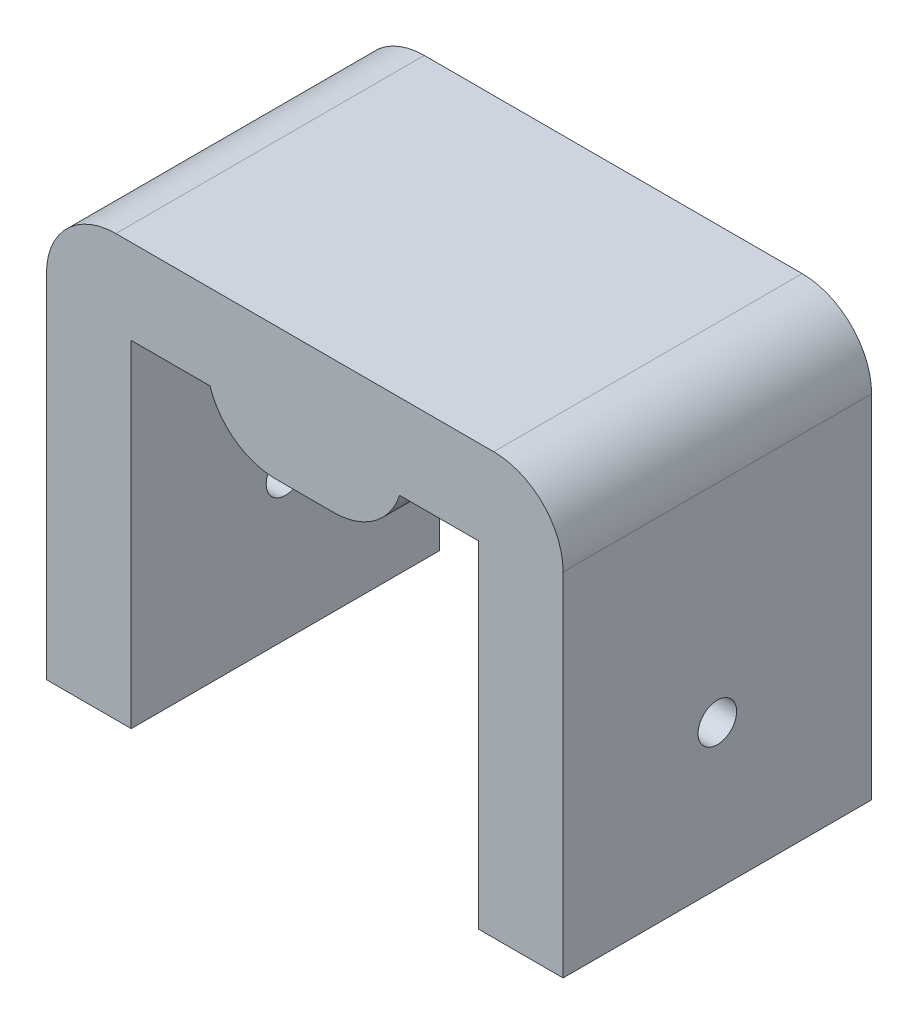
ISO-10303-21;
HEADER;
FILE_DESCRIPTION(('STEP AP214'),'2;1');
FILE_NAME('part.step','',(''),(''),'','','');
FILE_SCHEMA(('AUTOMOTIVE_DESIGN { 1 0 10303 214 1 1 1 1 }'));
ENDSEC;
DATA;
#1=APPLICATION_CONTEXT('core data for automotive mechanical design processes');
#2=APPLICATION_PROTOCOL_DEFINITION('international standard','automotive_design',2000,#1);
#3=PRODUCT_CONTEXT('',#1,'mechanical');
#4=PRODUCT('Part','Part','',(#3));
#5=PRODUCT_RELATED_PRODUCT_CATEGORY('part','',(#4));
#6=PRODUCT_DEFINITION_FORMATION('','',#4);
#7=PRODUCT_DEFINITION_CONTEXT('part definition',#1,'design');
#8=PRODUCT_DEFINITION('design','',#6,#7);
#9=PRODUCT_DEFINITION_SHAPE('','',#8);
#10=(LENGTH_UNIT() NAMED_UNIT(*) SI_UNIT(.MILLI.,.METRE.));
#11=(NAMED_UNIT(*) PLANE_ANGLE_UNIT() SI_UNIT($,.RADIAN.));
#12=(NAMED_UNIT(*) SI_UNIT($,.STERADIAN.) SOLID_ANGLE_UNIT());
#13=UNCERTAINTY_MEASURE_WITH_UNIT(LENGTH_MEASURE(1.E-05),#10,'distance_accuracy_value','');
#14=(GEOMETRIC_REPRESENTATION_CONTEXT(3) GLOBAL_UNCERTAINTY_ASSIGNED_CONTEXT((#13)) GLOBAL_UNIT_ASSIGNED_CONTEXT((#10,
#11,#12)) REPRESENTATION_CONTEXT('',''));
#15=CARTESIAN_POINT('',(0.,0.,0.));
#16=DIRECTION('',(0.,0.,1.));
#17=DIRECTION('',(1.,0.,0.));
#18=AXIS2_PLACEMENT_3D('',#15,#16,#17);
#19=CARTESIAN_POINT('',(-16.75,0.,20.));
#20=DIRECTION('',(-1.,0.,0.));
#21=DIRECTION('',(0.,-1.,0.));
#22=AXIS2_PLACEMENT_3D('',#19,#20,#21);
#23=PLANE('',#22);
#24=CARTESIAN_POINT('',(-16.75,9.35000000000001,10.));
#25=DIRECTION('',(1.,0.,0.));
#26=DIRECTION('',(0.,1.,0.));
#27=AXIS2_PLACEMENT_3D('',#24,#25,#26);
#28=CIRCLE('',#27,1.25);
#29=CARTESIAN_POINT('',(-16.75,10.6,10.));
#30=VERTEX_POINT('',#29);
#31=EDGE_CURVE('E290',#30,#30,#28,.T.);
#32=ORIENTED_EDGE('',*,*,#31,.T.);
#33=EDGE_LOOP('',(#32));
#34=FACE_BOUND('',#33,.T.);
#35=DIRECTION('',(0.,1.,0.));
#36=VECTOR('',#35,1.);
#37=CARTESIAN_POINT('',(-16.75,0.,20.));
#38=LINE('',#37,#36);
#39=CARTESIAN_POINT('',(-16.75,0.,20.));
#40=VERTEX_POINT('',#39);
#41=CARTESIAN_POINT('',(-16.75,22.8,20.));
#42=VERTEX_POINT('',#41);
#43=EDGE_CURVE('E205',#40,#42,#38,.T.);
#44=ORIENTED_EDGE('',*,*,#43,.T.);
#45=DIRECTION('',(0.,0.,-1.));
#46=VECTOR('',#45,1.);
#47=CARTESIAN_POINT('',(-16.75,22.8,20.));
#48=LINE('',#47,#46);
#49=CARTESIAN_POINT('',(-16.75,22.8,0.));
#50=VERTEX_POINT('',#49);
#51=EDGE_CURVE('E235',#42,#50,#48,.T.);
#52=ORIENTED_EDGE('',*,*,#51,.T.);
#53=DIRECTION('',(0.,1.,0.));
#54=VECTOR('',#53,1.);
#55=CARTESIAN_POINT('',(-16.75,0.,0.));
#56=LINE('',#55,#54);
#57=CARTESIAN_POINT('',(-16.75,0.,0.));
#58=VERTEX_POINT('',#57);
#59=EDGE_CURVE('E177',#58,#50,#56,.T.);
#60=ORIENTED_EDGE('',*,*,#59,.F.);
#61=DIRECTION('',(0.,0.,-1.));
#62=VECTOR('',#61,1.);
#63=CARTESIAN_POINT('',(-16.75,0.,20.));
#64=LINE('',#63,#62);
#65=EDGE_CURVE('E206',#40,#58,#64,.T.);
#66=ORIENTED_EDGE('',*,*,#65,.F.);
#67=EDGE_LOOP('',(#44,#52,#60,#66));
#68=FACE_BOUND('',#67,.T.);
#69=ADVANCED_FACE('F33',(#34,#68),#23,.T.);
#70=CARTESIAN_POINT('',(-11.25,0.,20.));
#71=DIRECTION('',(0.,-1.,0.));
#72=DIRECTION('',(1.,0.,0.));
#73=AXIS2_PLACEMENT_3D('',#70,#71,#72);
#74=PLANE('',#73);
#75=DIRECTION('',(-1.,0.,0.));
#76=VECTOR('',#75,1.);
#77=CARTESIAN_POINT('',(-11.25,0.,0.));
#78=LINE('',#77,#76);
#79=CARTESIAN_POINT('',(-11.25,0.,0.));
#80=VERTEX_POINT('',#79);
#81=EDGE_CURVE('E202',#80,#58,#78,.T.);
#82=ORIENTED_EDGE('',*,*,#81,.F.);
#83=DIRECTION('',(0.,0.,-1.));
#84=VECTOR('',#83,1.);
#85=CARTESIAN_POINT('',(-11.25,0.,20.));
#86=LINE('',#85,#84);
#87=CARTESIAN_POINT('',(-11.25,0.,20.));
#88=VERTEX_POINT('',#87);
#89=EDGE_CURVE('E209',#88,#80,#86,.T.);
#90=ORIENTED_EDGE('',*,*,#89,.F.);
#91=DIRECTION('',(-1.,0.,0.));
#92=VECTOR('',#91,1.);
#93=CARTESIAN_POINT('',(-11.25,0.,20.));
#94=LINE('',#93,#92);
#95=EDGE_CURVE('E153',#88,#40,#94,.T.);
#96=ORIENTED_EDGE('',*,*,#95,.T.);
#97=ORIENTED_EDGE('',*,*,#65,.T.);
#98=EDGE_LOOP('',(#82,#90,#96,#97));
#99=FACE_BOUND('',#98,.T.);
#100=ADVANCED_FACE('F266',(#99),#74,.T.);
#101=CARTESIAN_POINT('',(-11.25,21.8,20.));
#102=DIRECTION('',(1.,0.,0.));
#103=DIRECTION('',(0.,1.,0.));
#104=AXIS2_PLACEMENT_3D('',#101,#102,#103);
#105=PLANE('',#104);
#106=CARTESIAN_POINT('',(-11.25,9.35000000000001,10.));
#107=DIRECTION('',(1.,0.,0.));
#108=DIRECTION('',(0.,1.,0.));
#109=AXIS2_PLACEMENT_3D('',#106,#107,#108);
#110=CIRCLE('',#109,1.25);
#111=CARTESIAN_POINT('',(-11.25,10.6,10.));
#112=VERTEX_POINT('',#111);
#113=EDGE_CURVE('E181',#112,#112,#110,.T.);
#114=ORIENTED_EDGE('',*,*,#113,.F.);
#115=EDGE_LOOP('',(#114));
#116=FACE_BOUND('',#115,.T.);
#117=DIRECTION('',(0.,-1.,0.));
#118=VECTOR('',#117,1.);
#119=CARTESIAN_POINT('',(-11.25,21.8,0.));
#120=LINE('',#119,#118);
#121=CARTESIAN_POINT('',(-11.25,21.8,0.));
#122=VERTEX_POINT('',#121);
#123=EDGE_CURVE('E199',#122,#80,#120,.T.);
#124=ORIENTED_EDGE('',*,*,#123,.F.);
#125=DIRECTION('',(0.,0.,-1.));
#126=VECTOR('',#125,1.);
#127=CARTESIAN_POINT('',(-11.25,21.8,20.));
#128=LINE('',#127,#126);
#129=CARTESIAN_POINT('',(-11.25,21.8,20.));
#130=VERTEX_POINT('',#129);
#131=EDGE_CURVE('E211',#130,#122,#128,.T.);
#132=ORIENTED_EDGE('',*,*,#131,.F.);
#133=DIRECTION('',(0.,-1.,0.));
#134=VECTOR('',#133,1.);
#135=CARTESIAN_POINT('',(-11.25,21.8,20.));
#136=LINE('',#135,#134);
#137=EDGE_CURVE('E172',#130,#88,#136,.T.);
#138=ORIENTED_EDGE('',*,*,#137,.T.);
#139=ORIENTED_EDGE('',*,*,#89,.T.);
#140=EDGE_LOOP('',(#124,#132,#138,#139));
#141=FACE_BOUND('',#140,.T.);
#142=ADVANCED_FACE('F263',(#116,#141),#105,.T.);
#143=CARTESIAN_POINT('',(-6.15,21.8,20.));
#144=DIRECTION('',(0.,-1.,0.));
#145=DIRECTION('',(0.,0.,-1.));
#146=AXIS2_PLACEMENT_3D('',#143,#144,#145);
#147=PLANE('',#146);
#148=DIRECTION('',(-1.,0.,0.));
#149=VECTOR('',#148,1.);
#150=CARTESIAN_POINT('',(-6.15,21.8,0.));
#151=LINE('',#150,#149);
#152=CARTESIAN_POINT('',(-6.15,21.8,0.));
#153=VERTEX_POINT('',#152);
#154=EDGE_CURVE('E196',#153,#122,#151,.T.);
#155=ORIENTED_EDGE('',*,*,#154,.F.);
#156=DIRECTION('',(0.,0.,-1.));
#157=VECTOR('',#156,1.);
#158=CARTESIAN_POINT('',(-6.15,21.8,20.));
#159=LINE('',#158,#157);
#160=CARTESIAN_POINT('',(-6.15,21.8,20.));
#161=VERTEX_POINT('',#160);
#162=EDGE_CURVE('E213',#161,#153,#159,.T.);
#163=ORIENTED_EDGE('',*,*,#162,.F.);
#164=DIRECTION('',(-1.,0.,0.));
#165=VECTOR('',#164,1.);
#166=CARTESIAN_POINT('',(-6.15,21.8,20.));
#167=LINE('',#166,#165);
#168=EDGE_CURVE('E169',#161,#130,#167,.T.);
#169=ORIENTED_EDGE('',*,*,#168,.T.);
#170=ORIENTED_EDGE('',*,*,#131,.T.);
#171=EDGE_LOOP('',(#155,#163,#169,#170));
#172=FACE_BOUND('',#171,.T.);
#173=ADVANCED_FACE('F259',(#172),#147,.T.);
#174=CARTESIAN_POINT('',(6.15,18.7,20.));
#175=DIRECTION('',(0.,-1.,0.));
#176=DIRECTION('',(0.,0.,-1.));
#177=AXIS2_PLACEMENT_3D('',#174,#175,#176);
#178=PLANE('',#177);
#179=DIRECTION('',(-1.,0.,0.));
#180=VECTOR('',#179,1.);
#181=CARTESIAN_POINT('',(6.15,18.7,20.));
#182=LINE('',#181,#180);
#183=CARTESIAN_POINT('',(1.87331904393138,18.7,20.));
#184=VERTEX_POINT('',#183);
#185=CARTESIAN_POINT('',(-1.87331904393138,18.7,20.));
#186=VERTEX_POINT('',#185);
#187=EDGE_CURVE('E167',#184,#186,#182,.T.);
#188=ORIENTED_EDGE('',*,*,#187,.T.);
#189=DIRECTION('',(0.,0.,-1.));
#190=VECTOR('',#189,1.);
#191=CARTESIAN_POINT('',(-1.87331904393138,18.7,0.));
#192=LINE('',#191,#190);
#193=CARTESIAN_POINT('',(-1.87331904393138,18.7,0.));
#194=VERTEX_POINT('',#193);
#195=EDGE_CURVE('E239',#186,#194,#192,.T.);
#196=ORIENTED_EDGE('',*,*,#195,.T.);
#197=DIRECTION('',(-1.,0.,0.));
#198=VECTOR('',#197,1.);
#199=CARTESIAN_POINT('',(6.15,18.7,0.));
#200=LINE('',#199,#198);
#201=CARTESIAN_POINT('',(1.87331904393138,18.7,0.));
#202=VERTEX_POINT('',#201);
#203=EDGE_CURVE('E193',#202,#194,#200,.T.);
#204=ORIENTED_EDGE('',*,*,#203,.F.);
#205=DIRECTION('',(0.,0.,1.));
#206=VECTOR('',#205,1.);
#207=CARTESIAN_POINT('',(1.87331904393138,18.7,20.));
#208=LINE('',#207,#206);
#209=EDGE_CURVE('E53',#202,#184,#208,.T.);
#210=ORIENTED_EDGE('',*,*,#209,.T.);
#211=EDGE_LOOP('',(#188,#196,#204,#210));
#212=FACE_BOUND('',#211,.T.);
#213=ADVANCED_FACE('F253',(#212),#178,.T.);
#214=CARTESIAN_POINT('',(11.25,21.8,20.));
#215=DIRECTION('',(0.,-1.,0.));
#216=DIRECTION('',(0.,0.,-1.));
#217=AXIS2_PLACEMENT_3D('',#214,#215,#216);
#218=PLANE('',#217);
#219=DIRECTION('',(-1.,0.,0.));
#220=VECTOR('',#219,1.);
#221=CARTESIAN_POINT('',(11.25,21.8,0.));
#222=LINE('',#221,#220);
#223=CARTESIAN_POINT('',(11.25,21.8,0.));
#224=VERTEX_POINT('',#223);
#225=CARTESIAN_POINT('',(6.15,21.8,0.));
#226=VERTEX_POINT('',#225);
#227=EDGE_CURVE('E190',#224,#226,#222,.T.);
#228=ORIENTED_EDGE('',*,*,#227,.F.);
#229=DIRECTION('',(0.,0.,-1.));
#230=VECTOR('',#229,1.);
#231=CARTESIAN_POINT('',(11.25,21.8,20.));
#232=LINE('',#231,#230);
#233=CARTESIAN_POINT('',(11.25,21.8,20.));
#234=VERTEX_POINT('',#233);
#235=EDGE_CURVE('E219',#234,#224,#232,.T.);
#236=ORIENTED_EDGE('',*,*,#235,.F.);
#237=DIRECTION('',(-1.,0.,0.));
#238=VECTOR('',#237,1.);
#239=CARTESIAN_POINT('',(11.25,21.8,20.));
#240=LINE('',#239,#238);
#241=CARTESIAN_POINT('',(6.15,21.8,20.));
#242=VERTEX_POINT('',#241);
#243=EDGE_CURVE('E161',#234,#242,#240,.T.);
#244=ORIENTED_EDGE('',*,*,#243,.T.);
#245=DIRECTION('',(0.,0.,-1.));
#246=VECTOR('',#245,1.);
#247=CARTESIAN_POINT('',(6.15,21.8,20.));
#248=LINE('',#247,#246);
#249=EDGE_CURVE('E216',#242,#226,#248,.T.);
#250=ORIENTED_EDGE('',*,*,#249,.T.);
#251=EDGE_LOOP('',(#228,#236,#244,#250));
#252=FACE_BOUND('',#251,.T.);
#253=ADVANCED_FACE('F250',(#252),#218,.T.);
#254=CARTESIAN_POINT('',(11.25,0.,20.));
#255=DIRECTION('',(-1.,0.,0.));
#256=DIRECTION('',(0.,-1.,0.));
#257=AXIS2_PLACEMENT_3D('',#254,#255,#256);
#258=PLANE('',#257);
#259=CARTESIAN_POINT('',(11.25,9.35,10.));
#260=DIRECTION('',(-1.,0.,0.));
#261=DIRECTION('',(0.,-1.,0.));
#262=AXIS2_PLACEMENT_3D('',#259,#260,#261);
#263=CIRCLE('',#262,1.25);
#264=CARTESIAN_POINT('',(11.25,8.1,10.));
#265=VERTEX_POINT('',#264);
#266=EDGE_CURVE('E287',#265,#265,#263,.T.);
#267=ORIENTED_EDGE('',*,*,#266,.F.);
#268=EDGE_LOOP('',(#267));
#269=FACE_BOUND('',#268,.T.);
#270=DIRECTION('',(0.,1.,0.));
#271=VECTOR('',#270,1.);
#272=CARTESIAN_POINT('',(11.25,0.,0.));
#273=LINE('',#272,#271);
#274=CARTESIAN_POINT('',(11.25,0.,0.));
#275=VERTEX_POINT('',#274);
#276=EDGE_CURVE('E187',#275,#224,#273,.T.);
#277=ORIENTED_EDGE('',*,*,#276,.F.);
#278=DIRECTION('',(0.,0.,-1.));
#279=VECTOR('',#278,1.);
#280=CARTESIAN_POINT('',(11.25,0.,20.));
#281=LINE('',#280,#279);
#282=CARTESIAN_POINT('',(11.25,0.,20.));
#283=VERTEX_POINT('',#282);
#284=EDGE_CURVE('E152',#283,#275,#281,.T.);
#285=ORIENTED_EDGE('',*,*,#284,.F.);
#286=DIRECTION('',(0.,1.,0.));
#287=VECTOR('',#286,1.);
#288=CARTESIAN_POINT('',(11.25,0.,20.));
#289=LINE('',#288,#287);
#290=EDGE_CURVE('E159',#283,#234,#289,.T.);
#291=ORIENTED_EDGE('',*,*,#290,.T.);
#292=ORIENTED_EDGE('',*,*,#235,.T.);
#293=EDGE_LOOP('',(#277,#285,#291,#292));
#294=FACE_BOUND('',#293,.T.);
#295=ADVANCED_FACE('F353',(#269,#294),#258,.T.);
#296=CARTESIAN_POINT('',(16.75,0.,20.));
#297=DIRECTION('',(0.,-1.,0.));
#298=DIRECTION('',(1.,0.,0.));
#299=AXIS2_PLACEMENT_3D('',#296,#297,#298);
#300=PLANE('',#299);
#301=DIRECTION('',(-1.,0.,0.));
#302=VECTOR('',#301,1.);
#303=CARTESIAN_POINT('',(16.75,0.,0.));
#304=LINE('',#303,#302);
#305=CARTESIAN_POINT('',(16.75,0.,0.));
#306=VERTEX_POINT('',#305);
#307=EDGE_CURVE('E151',#306,#275,#304,.T.);
#308=ORIENTED_EDGE('',*,*,#307,.F.);
#309=DIRECTION('',(0.,0.,-1.));
#310=VECTOR('',#309,1.);
#311=CARTESIAN_POINT('',(16.75,0.,20.));
#312=LINE('',#311,#310);
#313=CARTESIAN_POINT('',(16.75,0.,20.));
#314=VERTEX_POINT('',#313);
#315=EDGE_CURVE('E138',#314,#306,#312,.T.);
#316=ORIENTED_EDGE('',*,*,#315,.F.);
#317=DIRECTION('',(-1.,0.,0.));
#318=VECTOR('',#317,1.);
#319=CARTESIAN_POINT('',(16.75,0.,20.));
#320=LINE('',#319,#318);
#321=EDGE_CURVE('E144',#314,#283,#320,.T.);
#322=ORIENTED_EDGE('',*,*,#321,.T.);
#323=ORIENTED_EDGE('',*,*,#284,.T.);
#324=EDGE_LOOP('',(#308,#316,#322,#323));
#325=FACE_BOUND('',#324,.T.);
#326=ADVANCED_FACE('F149',(#325),#300,.T.);
#327=CARTESIAN_POINT('',(16.75,27.3,20.));
#328=DIRECTION('',(1.,0.,0.));
#329=DIRECTION('',(0.,1.,0.));
#330=AXIS2_PLACEMENT_3D('',#327,#328,#329);
#331=PLANE('',#330);
#332=CARTESIAN_POINT('',(16.75,9.35,10.));
#333=DIRECTION('',(1.,0.,0.));
#334=DIRECTION('',(0.,1.,0.));
#335=AXIS2_PLACEMENT_3D('',#332,#333,#334);
#336=CIRCLE('',#335,1.25);
#337=CARTESIAN_POINT('',(16.75,10.6,10.));
#338=VERTEX_POINT('',#337);
#339=EDGE_CURVE('E291',#338,#338,#336,.T.);
#340=ORIENTED_EDGE('',*,*,#339,.F.);
#341=EDGE_LOOP('',(#340));
#342=FACE_BOUND('',#341,.T.);
#343=DIRECTION('',(0.,-1.,0.));
#344=VECTOR('',#343,1.);
#345=CARTESIAN_POINT('',(16.75,27.3,0.));
#346=LINE('',#345,#344);
#347=CARTESIAN_POINT('',(16.75,22.8,0.));
#348=VERTEX_POINT('',#347);
#349=EDGE_CURVE('E184',#348,#306,#346,.T.);
#350=ORIENTED_EDGE('',*,*,#349,.F.);
#351=DIRECTION('',(0.,0.,-1.));
#352=VECTOR('',#351,1.);
#353=CARTESIAN_POINT('',(16.75,22.8,20.));
#354=LINE('',#353,#352);
#355=CARTESIAN_POINT('',(16.75,22.8,20.));
#356=VERTEX_POINT('',#355);
#357=EDGE_CURVE('E141',#348,#356,#354,.F.);
#358=ORIENTED_EDGE('',*,*,#357,.T.);
#359=DIRECTION('',(0.,-1.,0.));
#360=VECTOR('',#359,1.);
#361=CARTESIAN_POINT('',(16.75,27.3,20.));
#362=LINE('',#361,#360);
#363=EDGE_CURVE('E134',#356,#314,#362,.T.);
#364=ORIENTED_EDGE('',*,*,#363,.T.);
#365=ORIENTED_EDGE('',*,*,#315,.T.);
#366=EDGE_LOOP('',(#350,#358,#364,#365));
#367=FACE_BOUND('',#366,.T.);
#368=ADVANCED_FACE('F137',(#342,#367),#331,.T.);
#369=CARTESIAN_POINT('',(-16.75,27.3,20.));
#370=DIRECTION('',(0.,1.,0.));
#371=DIRECTION('',(-1.,0.,0.));
#372=AXIS2_PLACEMENT_3D('',#369,#370,#371);
#373=PLANE('',#372);
#374=DIRECTION('',(1.,0.,0.));
#375=VECTOR('',#374,1.);
#376=CARTESIAN_POINT('',(-16.75,27.3,20.));
#377=LINE('',#376,#375);
#378=CARTESIAN_POINT('',(-12.25,27.3,20.));
#379=VERTEX_POINT('',#378);
#380=CARTESIAN_POINT('',(12.25,27.3,20.));
#381=VERTEX_POINT('',#380);
#382=EDGE_CURVE('E145',#379,#381,#377,.T.);
#383=ORIENTED_EDGE('',*,*,#382,.T.);
#384=DIRECTION('',(0.,0.,-1.));
#385=VECTOR('',#384,1.);
#386=CARTESIAN_POINT('',(12.25,27.3,20.));
#387=LINE('',#386,#385);
#388=CARTESIAN_POINT('',(12.25,27.3,0.));
#389=VERTEX_POINT('',#388);
#390=EDGE_CURVE('E223',#381,#389,#387,.T.);
#391=ORIENTED_EDGE('',*,*,#390,.T.);
#392=DIRECTION('',(1.,0.,0.));
#393=VECTOR('',#392,1.);
#394=CARTESIAN_POINT('',(-16.75,27.3,0.));
#395=LINE('',#394,#393);
#396=CARTESIAN_POINT('',(-12.25,27.3,0.));
#397=VERTEX_POINT('',#396);
#398=EDGE_CURVE('E180',#397,#389,#395,.T.);
#399=ORIENTED_EDGE('',*,*,#398,.F.);
#400=DIRECTION('',(0.,0.,-1.));
#401=VECTOR('',#400,1.);
#402=CARTESIAN_POINT('',(-12.25,27.3,20.));
#403=LINE('',#402,#401);
#404=EDGE_CURVE('E208',#397,#379,#403,.F.);
#405=ORIENTED_EDGE('',*,*,#404,.T.);
#406=EDGE_LOOP('',(#383,#391,#399,#405));
#407=FACE_BOUND('',#406,.T.);
#408=ADVANCED_FACE('F278',(#407),#373,.T.);
#409=CARTESIAN_POINT('',(0.,0.,20.));
#410=DIRECTION('',(0.,0.,-1.));
#411=DIRECTION('',(-1.,0.,0.));
#412=AXIS2_PLACEMENT_3D('',#409,#410,#411);
#413=PLANE('',#412);
#414=ORIENTED_EDGE('',*,*,#168,.F.);
#415=CARTESIAN_POINT('',(-1.87331904393138,23.2,20.));
#416=DIRECTION('',(0.,0.,-1.));
#417=DIRECTION('',(-1.,0.,0.));
#418=AXIS2_PLACEMENT_3D('',#415,#416,#417);
#419=CIRCLE('',#418,4.5);
#420=EDGE_CURVE('E11',#161,#186,#419,.F.);
#421=ORIENTED_EDGE('',*,*,#420,.T.);
#422=ORIENTED_EDGE('',*,*,#187,.F.);
#423=CARTESIAN_POINT('',(1.87331904393138,23.2,20.));
#424=DIRECTION('',(0.,0.,-1.));
#425=DIRECTION('',(-1.,0.,0.));
#426=AXIS2_PLACEMENT_3D('',#423,#424,#425);
#427=CIRCLE('',#426,4.5);
#428=EDGE_CURVE('E41',#184,#242,#427,.F.);
#429=ORIENTED_EDGE('',*,*,#428,.T.);
#430=ORIENTED_EDGE('',*,*,#243,.F.);
#431=ORIENTED_EDGE('',*,*,#290,.F.);
#432=ORIENTED_EDGE('',*,*,#321,.F.);
#433=ORIENTED_EDGE('',*,*,#363,.F.);
#434=CARTESIAN_POINT('',(12.25,22.8,20.));
#435=DIRECTION('',(0.,0.,-1.));
#436=DIRECTION('',(-1.,0.,0.));
#437=AXIS2_PLACEMENT_3D('',#434,#435,#436);
#438=CIRCLE('',#437,4.5);
#439=EDGE_CURVE('E233',#356,#381,#438,.F.);
#440=ORIENTED_EDGE('',*,*,#439,.T.);
#441=ORIENTED_EDGE('',*,*,#382,.F.);
#442=CARTESIAN_POINT('',(-12.25,22.8,20.));
#443=DIRECTION('',(0.,0.,-1.));
#444=DIRECTION('',(-1.,0.,0.));
#445=AXIS2_PLACEMENT_3D('',#442,#443,#444);
#446=CIRCLE('',#445,4.5);
#447=EDGE_CURVE('E231',#379,#42,#446,.F.);
#448=ORIENTED_EDGE('',*,*,#447,.T.);
#449=ORIENTED_EDGE('',*,*,#43,.F.);
#450=ORIENTED_EDGE('',*,*,#95,.F.);
#451=ORIENTED_EDGE('',*,*,#137,.F.);
#452=EDGE_LOOP('',(#414,#421,#422,#429,#430,#431,#432,#433,#440,#441,#448,#449,#450,#451));
#453=FACE_BOUND('',#452,.T.);
#454=ADVANCED_FACE('F156',(#453),#413,.F.);
#455=CARTESIAN_POINT('',(0.,0.,0.));
#456=DIRECTION('',(0.,0.,-1.));
#457=DIRECTION('',(-1.,0.,0.));
#458=AXIS2_PLACEMENT_3D('',#455,#456,#457);
#459=PLANE('',#458);
#460=ORIENTED_EDGE('',*,*,#203,.T.);
#461=CARTESIAN_POINT('',(-1.87331904393138,23.2,0.));
#462=DIRECTION('',(0.,0.,-1.));
#463=DIRECTION('',(-1.,0.,0.));
#464=AXIS2_PLACEMENT_3D('',#461,#462,#463);
#465=CIRCLE('',#464,4.5);
#466=EDGE_CURVE('E244',#194,#153,#465,.T.);
#467=ORIENTED_EDGE('',*,*,#466,.T.);
#468=ORIENTED_EDGE('',*,*,#154,.T.);
#469=ORIENTED_EDGE('',*,*,#123,.T.);
#470=ORIENTED_EDGE('',*,*,#81,.T.);
#471=ORIENTED_EDGE('',*,*,#59,.T.);
#472=CARTESIAN_POINT('',(-12.25,22.8,0.));
#473=DIRECTION('',(0.,0.,-1.));
#474=DIRECTION('',(-1.,0.,0.));
#475=AXIS2_PLACEMENT_3D('',#472,#473,#474);
#476=CIRCLE('',#475,4.5);
#477=EDGE_CURVE('E226',#50,#397,#476,.T.);
#478=ORIENTED_EDGE('',*,*,#477,.T.);
#479=ORIENTED_EDGE('',*,*,#398,.T.);
#480=CARTESIAN_POINT('',(12.25,22.8,0.));
#481=DIRECTION('',(0.,0.,-1.));
#482=DIRECTION('',(-1.,0.,0.));
#483=AXIS2_PLACEMENT_3D('',#480,#481,#482);
#484=CIRCLE('',#483,4.5);
#485=EDGE_CURVE('E228',#389,#348,#484,.T.);
#486=ORIENTED_EDGE('',*,*,#485,.T.);
#487=ORIENTED_EDGE('',*,*,#349,.T.);
#488=ORIENTED_EDGE('',*,*,#307,.T.);
#489=ORIENTED_EDGE('',*,*,#276,.T.);
#490=ORIENTED_EDGE('',*,*,#227,.T.);
#491=CARTESIAN_POINT('',(1.87331904393138,23.2,0.));
#492=DIRECTION('',(0.,0.,-1.));
#493=DIRECTION('',(-1.,0.,0.));
#494=AXIS2_PLACEMENT_3D('',#491,#492,#493);
#495=CIRCLE('',#494,4.5);
#496=EDGE_CURVE('E242',#226,#202,#495,.T.);
#497=ORIENTED_EDGE('',*,*,#496,.T.);
#498=EDGE_LOOP('',(#460,#467,#468,#469,#470,#471,#478,#479,#486,#487,#488,#489,#490,#497));
#499=FACE_BOUND('',#498,.T.);
#500=ADVANCED_FACE('F252',(#499),#459,.T.);
#501=CARTESIAN_POINT('',(12.25,22.8,20.));
#502=DIRECTION('',(0.,0.,-1.));
#503=DIRECTION('',(-1.,0.,0.));
#504=AXIS2_PLACEMENT_3D('',#501,#502,#503);
#505=CYLINDRICAL_SURFACE('',#504,4.5);
#506=ORIENTED_EDGE('',*,*,#439,.F.);
#507=ORIENTED_EDGE('',*,*,#357,.F.);
#508=ORIENTED_EDGE('',*,*,#485,.F.);
#509=ORIENTED_EDGE('',*,*,#390,.F.);
#510=EDGE_LOOP('',(#506,#507,#508,#509));
#511=FACE_BOUND('',#510,.T.);
#512=ADVANCED_FACE('F317',(#511),#505,.T.);
#513=CARTESIAN_POINT('',(-12.25,22.8,20.));
#514=DIRECTION('',(0.,0.,-1.));
#515=DIRECTION('',(-1.,0.,0.));
#516=AXIS2_PLACEMENT_3D('',#513,#514,#515);
#517=CYLINDRICAL_SURFACE('',#516,4.5);
#518=ORIENTED_EDGE('',*,*,#447,.F.);
#519=ORIENTED_EDGE('',*,*,#404,.F.);
#520=ORIENTED_EDGE('',*,*,#477,.F.);
#521=ORIENTED_EDGE('',*,*,#51,.F.);
#522=EDGE_LOOP('',(#518,#519,#520,#521));
#523=FACE_BOUND('',#522,.T.);
#524=ADVANCED_FACE('F282',(#523),#517,.T.);
#525=CARTESIAN_POINT('',(-1.87331904393138,23.2,20.));
#526=DIRECTION('',(0.,0.,1.));
#527=DIRECTION('',(1.,0.,0.));
#528=AXIS2_PLACEMENT_3D('',#525,#526,#527);
#529=CYLINDRICAL_SURFACE('',#528,4.5);
#530=ORIENTED_EDGE('',*,*,#420,.F.);
#531=ORIENTED_EDGE('',*,*,#162,.T.);
#532=ORIENTED_EDGE('',*,*,#466,.F.);
#533=ORIENTED_EDGE('',*,*,#195,.F.);
#534=EDGE_LOOP('',(#530,#531,#532,#533));
#535=FACE_BOUND('',#534,.T.);
#536=ADVANCED_FACE('F256',(#535),#529,.T.);
#537=CARTESIAN_POINT('',(1.87331904393138,23.2,20.));
#538=DIRECTION('',(0.,0.,-1.));
#539=DIRECTION('',(-1.,0.,0.));
#540=AXIS2_PLACEMENT_3D('',#537,#538,#539);
#541=CYLINDRICAL_SURFACE('',#540,4.5);
#542=ORIENTED_EDGE('',*,*,#428,.F.);
#543=ORIENTED_EDGE('',*,*,#209,.F.);
#544=ORIENTED_EDGE('',*,*,#496,.F.);
#545=ORIENTED_EDGE('',*,*,#249,.F.);
#546=EDGE_LOOP('',(#542,#543,#544,#545));
#547=FACE_BOUND('',#546,.T.);
#548=ADVANCED_FACE('F35',(#547),#541,.T.);
#549=CARTESIAN_POINT('',(-16.75,9.35000000000001,10.));
#550=DIRECTION('',(1.,0.,0.));
#551=DIRECTION('',(0.,1.,0.));
#552=AXIS2_PLACEMENT_3D('',#549,#550,#551);
#553=CYLINDRICAL_SURFACE('',#552,1.25);
#554=ORIENTED_EDGE('',*,*,#266,.T.);
#555=EDGE_LOOP('',(#554));
#556=FACE_BOUND('',#555,.T.);
#557=ORIENTED_EDGE('',*,*,#339,.T.);
#558=EDGE_LOOP('',(#557));
#559=FACE_BOUND('',#558,.T.);
#560=ADVANCED_FACE('F300',(#556,#559),#553,.F.);
#561=ORIENTED_EDGE('',*,*,#113,.T.);
#562=EDGE_LOOP('',(#561));
#563=FACE_BOUND('',#562,.T.);
#564=ORIENTED_EDGE('',*,*,#31,.F.);
#565=EDGE_LOOP('',(#564));
#566=FACE_BOUND('',#565,.T.);
#567=ADVANCED_FACE('F298',(#563,#566),#553,.F.);
#568=CLOSED_SHELL('',(#69,#100,#142,#173,#213,#253,#295,#326,#368,#408,#454,#500,#512,#524,#536,
#548,#560,#567));
#569=MANIFOLD_SOLID_BREP('B2',#568);
#570=ADVANCED_BREP_SHAPE_REPRESENTATION('',(#18,#569),#14);
#571=SHAPE_DEFINITION_REPRESENTATION(#9,#570);
ENDSEC;
END-ISO-10303-21;
